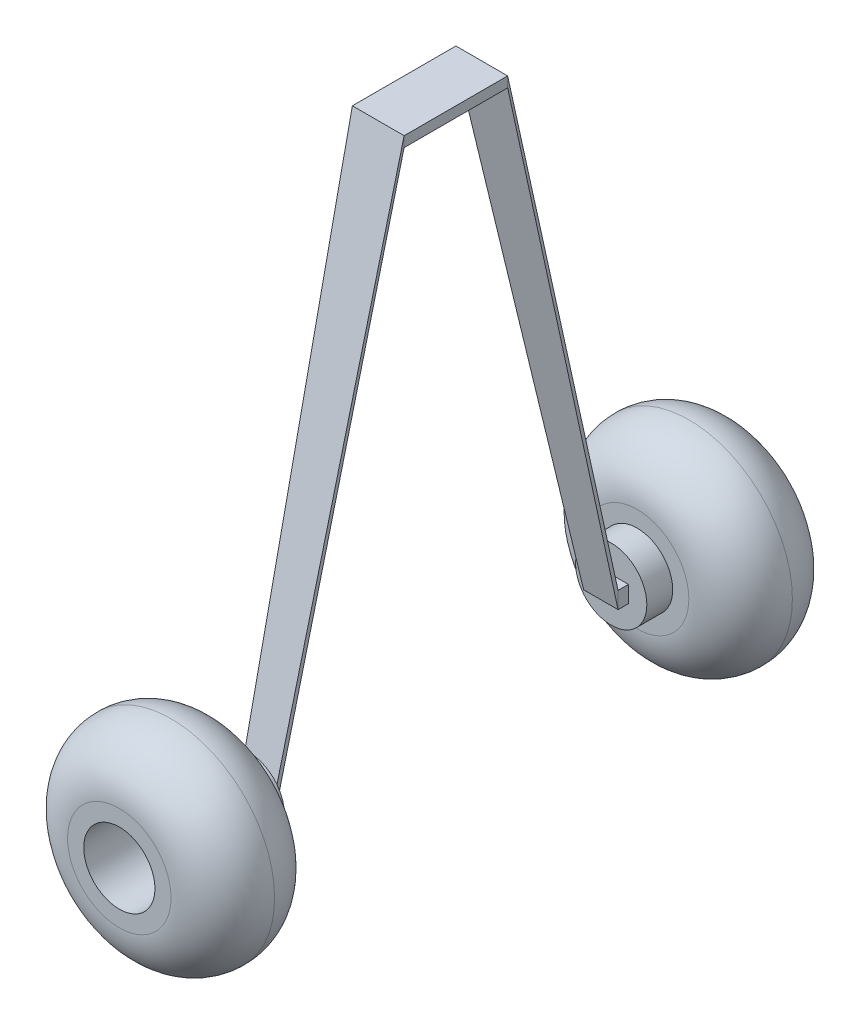
ISO-10303-21;
HEADER;
FILE_DESCRIPTION(('STEP AP214'),'2;1');
FILE_NAME('part.step','',(''),(''),'','','');
FILE_SCHEMA(('AUTOMOTIVE_DESIGN { 1 0 10303 214 1 1 1 1 }'));
ENDSEC;
DATA;
#1=APPLICATION_CONTEXT('core data for automotive mechanical design processes');
#2=APPLICATION_PROTOCOL_DEFINITION('international standard','automotive_design',2000,#1);
#3=PRODUCT_CONTEXT('',#1,'mechanical');
#4=PRODUCT('Part','Part','',(#3));
#5=PRODUCT_RELATED_PRODUCT_CATEGORY('part','',(#4));
#6=PRODUCT_DEFINITION_FORMATION('','',#4);
#7=PRODUCT_DEFINITION_CONTEXT('part definition',#1,'design');
#8=PRODUCT_DEFINITION('design','',#6,#7);
#9=PRODUCT_DEFINITION_SHAPE('','',#8);
#10=(LENGTH_UNIT() NAMED_UNIT(*) SI_UNIT(.MILLI.,.METRE.));
#11=(NAMED_UNIT(*) PLANE_ANGLE_UNIT() SI_UNIT($,.RADIAN.));
#12=(NAMED_UNIT(*) SI_UNIT($,.STERADIAN.) SOLID_ANGLE_UNIT());
#13=UNCERTAINTY_MEASURE_WITH_UNIT(LENGTH_MEASURE(1.E-05),#10,'distance_accuracy_value','');
#14=(GEOMETRIC_REPRESENTATION_CONTEXT(3) GLOBAL_UNCERTAINTY_ASSIGNED_CONTEXT((#13)) GLOBAL_UNIT_ASSIGNED_CONTEXT((#10,
#11,#12)) REPRESENTATION_CONTEXT('',''));
#15=CARTESIAN_POINT('',(0.,0.,0.));
#16=DIRECTION('',(0.,0.,1.));
#17=DIRECTION('',(1.,0.,0.));
#18=AXIS2_PLACEMENT_3D('',#15,#16,#17);
#19=CARTESIAN_POINT('',(0.,0.,-160.));
#20=DIRECTION('',(0.,0.,1.));
#21=DIRECTION('',(1.,0.,0.));
#22=AXIS2_PLACEMENT_3D('',#19,#20,#21);
#23=PLANE('',#22);
#24=CARTESIAN_POINT('',(0.,0.,-160.));
#25=DIRECTION('',(0.,0.,1.));
#26=DIRECTION('',(1.,0.,0.));
#27=AXIS2_PLACEMENT_3D('',#24,#25,#26);
#28=CIRCLE('',#27,19.9762942594619);
#29=CARTESIAN_POINT('',(19.9762942594619,0.,-160.));
#30=VERTEX_POINT('',#29);
#31=EDGE_CURVE('E12',#30,#30,#28,.T.);
#32=ORIENTED_EDGE('',*,*,#31,.T.);
#33=EDGE_LOOP('',(#32));
#34=FACE_BOUND('',#33,.T.);
#35=CARTESIAN_POINT('',(0.,0.,-160.));
#36=DIRECTION('',(0.,0.,1.));
#37=DIRECTION('',(1.,0.,0.));
#38=AXIS2_PLACEMENT_3D('',#35,#36,#37);
#39=CIRCLE('',#38,13.7512739728367);
#40=CARTESIAN_POINT('',(13.7512739728367,0.,-160.));
#41=VERTEX_POINT('',#40);
#42=EDGE_CURVE('E84',#41,#41,#39,.T.);
#43=ORIENTED_EDGE('',*,*,#42,.F.);
#44=EDGE_LOOP('',(#43));
#45=FACE_BOUND('',#44,.T.);
#46=ADVANCED_FACE('F72',(#34,#45),#23,.T.);
#47=CARTESIAN_POINT('',(0.,0.,-200.));
#48=DIRECTION('',(0.,0.,1.));
#49=DIRECTION('',(1.,0.,0.));
#50=AXIS2_PLACEMENT_3D('',#47,#48,#49);
#51=PLANE('',#50);
#52=CARTESIAN_POINT('',(0.,0.,-200.));
#53=DIRECTION('',(0.,0.,1.));
#54=DIRECTION('',(1.,0.,0.));
#55=AXIS2_PLACEMENT_3D('',#52,#53,#54);
#56=CIRCLE('',#55,19.9762942594619);
#57=CARTESIAN_POINT('',(19.9762942594619,0.,-200.));
#58=VERTEX_POINT('',#57);
#59=EDGE_CURVE('E80',#58,#58,#56,.F.);
#60=ORIENTED_EDGE('',*,*,#59,.T.);
#61=EDGE_LOOP('',(#60));
#62=FACE_BOUND('',#61,.T.);
#63=CARTESIAN_POINT('',(0.,0.,-200.));
#64=DIRECTION('',(0.,0.,1.));
#65=DIRECTION('',(1.,0.,0.));
#66=AXIS2_PLACEMENT_3D('',#63,#64,#65);
#67=CIRCLE('',#66,13.7512739728367);
#68=CARTESIAN_POINT('',(13.7512739728367,0.,-200.));
#69=VERTEX_POINT('',#68);
#70=EDGE_CURVE('E87',#69,#69,#67,.T.);
#71=ORIENTED_EDGE('',*,*,#70,.T.);
#72=EDGE_LOOP('',(#71));
#73=FACE_BOUND('',#72,.T.);
#74=ADVANCED_FACE('F97',(#62,#73),#51,.F.);
#75=CARTESIAN_POINT('',(0.,0.,-160.));
#76=DIRECTION('',(0.,0.,-1.));
#77=DIRECTION('',(-1.,0.,0.));
#78=AXIS2_PLACEMENT_3D('',#75,#76,#77);
#79=CYLINDRICAL_SURFACE('',#78,13.7512739728367);
#80=ORIENTED_EDGE('',*,*,#42,.T.);
#81=EDGE_LOOP('',(#80));
#82=FACE_BOUND('',#81,.T.);
#83=ORIENTED_EDGE('',*,*,#70,.F.);
#84=EDGE_LOOP('',(#83));
#85=FACE_BOUND('',#84,.T.);
#86=ADVANCED_FACE('F93',(#82,#85),#79,.F.);
#87=CARTESIAN_POINT('',(0.,0.,-180.));
#88=DIRECTION('',(0.,0.,1.));
#89=DIRECTION('',(1.,0.,0.));
#90=AXIS2_PLACEMENT_3D('',#87,#88,#89);
#91=DEGENERATE_TOROIDAL_SURFACE('',#90,19.9762942594619,20.,.T.);
#92=ORIENTED_EDGE('',*,*,#31,.F.);
#93=EDGE_LOOP('',(#92));
#94=FACE_BOUND('',#93,.T.);
#95=CARTESIAN_POINT('',(0.,0.,-180.));
#96=DIRECTION('',(0.,0.,1.));
#97=DIRECTION('',(1.,0.,0.));
#98=AXIS2_PLACEMENT_3D('',#95,#96,#97);
#99=CIRCLE('',#98,39.9762942594619);
#100=CARTESIAN_POINT('',(39.9762942594619,0.,-180.));
#101=VERTEX_POINT('',#100);
#102=EDGE_CURVE('E76',#101,#101,#99,.F.);
#103=ORIENTED_EDGE('',*,*,#102,.F.);
#104=EDGE_LOOP('',(#103));
#105=FACE_BOUND('',#104,.T.);
#106=ADVANCED_FACE('F74',(#94,#105),#91,.T.);
#107=CARTESIAN_POINT('',(0.,0.,-180.));
#108=DIRECTION('',(0.,0.,1.));
#109=DIRECTION('',(1.,0.,0.));
#110=AXIS2_PLACEMENT_3D('',#107,#108,#109);
#111=DEGENERATE_TOROIDAL_SURFACE('',#110,19.9762942594619,20.,.T.);
#112=ORIENTED_EDGE('',*,*,#59,.F.);
#113=EDGE_LOOP('',(#112));
#114=FACE_BOUND('',#113,.T.);
#115=ORIENTED_EDGE('',*,*,#102,.T.);
#116=EDGE_LOOP('',(#115));
#117=FACE_BOUND('',#116,.T.);
#118=ADVANCED_FACE('F105',(#114,#117),#111,.T.);
#119=CLOSED_SHELL('',(#46,#74,#86,#106,#118));
#120=MANIFOLD_SOLID_BREP('B2',#119);
#121=CARTESIAN_POINT('',(0.,0.,-10.));
#122=DIRECTION('',(0.,0.,-1.));
#123=DIRECTION('',(-1.,0.,0.));
#124=AXIS2_PLACEMENT_3D('',#121,#122,#123);
#125=PLANE('',#124);
#126=CARTESIAN_POINT('',(0.,0.,-10.));
#127=DIRECTION('',(0.,0.,-1.));
#128=DIRECTION('',(-1.,0.,0.));
#129=AXIS2_PLACEMENT_3D('',#126,#127,#128);
#130=CIRCLE('',#129,13.7512739728367);
#131=CARTESIAN_POINT('',(-13.7512739728367,0.,-10.));
#132=VERTEX_POINT('',#131);
#133=EDGE_CURVE('E70',#132,#132,#130,.T.);
#134=ORIENTED_EDGE('',*,*,#133,.T.);
#135=EDGE_LOOP('',(#134));
#136=FACE_BOUND('',#135,.T.);
#137=DIRECTION('',(-1.,0.,0.));
#138=VECTOR('',#137,1.);
#139=CARTESIAN_POINT('',(6.64674504633095,-3.23105661974372,-10.));
#140=LINE('',#139,#138);
#141=CARTESIAN_POINT('',(6.64674504633095,-3.23105661974372,-10.));
#142=VERTEX_POINT('',#141);
#143=CARTESIAN_POINT('',(-6.64674504633095,-3.23105661974372,-10.));
#144=VERTEX_POINT('',#143);
#145=EDGE_CURVE('E237',#142,#144,#140,.T.);
#146=ORIENTED_EDGE('',*,*,#145,.F.);
#147=DIRECTION('',(0.,1.,0.));
#148=VECTOR('',#147,1.);
#149=CARTESIAN_POINT('',(6.64674504633095,-3.23105661974372,-10.));
#150=LINE('',#149,#148);
#151=CARTESIAN_POINT('',(6.64674504633095,3.23105661974372,-10.));
#152=VERTEX_POINT('',#151);
#153=EDGE_CURVE('E186',#142,#152,#150,.T.);
#154=ORIENTED_EDGE('',*,*,#153,.T.);
#155=DIRECTION('',(-1.,0.,0.));
#156=VECTOR('',#155,1.);
#157=CARTESIAN_POINT('',(6.64674504633095,3.23105661974372,-10.));
#158=LINE('',#157,#156);
#159=CARTESIAN_POINT('',(-6.64674504633095,3.23105661974372,-10.));
#160=VERTEX_POINT('',#159);
#161=EDGE_CURVE('E546',#152,#160,#158,.T.);
#162=ORIENTED_EDGE('',*,*,#161,.T.);
#163=DIRECTION('',(0.,1.,0.));
#164=VECTOR('',#163,1.);
#165=CARTESIAN_POINT('',(-6.64674504633095,-3.23105661974372,-10.));
#166=LINE('',#165,#164);
#167=EDGE_CURVE('E549',#144,#160,#166,.T.);
#168=ORIENTED_EDGE('',*,*,#167,.F.);
#169=EDGE_LOOP('',(#146,#154,#162,#168));
#170=FACE_BOUND('',#169,.T.);
#171=ADVANCED_FACE('F166',(#136,#170),#125,.T.);
#172=CARTESIAN_POINT('',(0.,0.,-10.));
#173=DIRECTION('',(0.,0.,1.));
#174=DIRECTION('',(1.,0.,0.));
#175=AXIS2_PLACEMENT_3D('',#172,#173,#174);
#176=CYLINDRICAL_SURFACE('',#175,13.7512739728367);
#177=ORIENTED_EDGE('',*,*,#133,.F.);
#178=EDGE_LOOP('',(#177));
#179=FACE_BOUND('',#178,.T.);
#180=CARTESIAN_POINT('',(0.,0.,0.));
#181=DIRECTION('',(0.,0.,-1.));
#182=DIRECTION('',(-1.,0.,0.));
#183=AXIS2_PLACEMENT_3D('',#180,#181,#182);
#184=CIRCLE('',#183,13.7512739728367);
#185=CARTESIAN_POINT('',(-13.7512739728367,0.,0.));
#186=VERTEX_POINT('',#185);
#187=EDGE_CURVE('E177',#186,#186,#184,.T.);
#188=ORIENTED_EDGE('',*,*,#187,.T.);
#189=EDGE_LOOP('',(#188));
#190=FACE_BOUND('',#189,.T.);
#191=ADVANCED_FACE('F168',(#179,#190),#176,.T.);
#192=CARTESIAN_POINT('',(0.,0.,0.));
#193=DIRECTION('',(0.,0.,-1.));
#194=DIRECTION('',(-1.,0.,0.));
#195=AXIS2_PLACEMENT_3D('',#192,#193,#194);
#196=PLANE('',#195);
#197=ORIENTED_EDGE('',*,*,#187,.F.);
#198=EDGE_LOOP('',(#197));
#199=FACE_BOUND('',#198,.T.);
#200=ADVANCED_FACE('F523',(#199),#196,.F.);
#201=CARTESIAN_POINT('',(6.64674504633095,-3.23105661974372,-14.));
#202=DIRECTION('',(1.,0.,0.));
#203=DIRECTION('',(0.,0.,-1.));
#204=AXIS2_PLACEMENT_3D('',#201,#202,#203);
#205=PLANE('',#204);
#206=ORIENTED_EDGE('',*,*,#153,.F.);
#207=DIRECTION('',(0.,0.,1.));
#208=VECTOR('',#207,1.);
#209=CARTESIAN_POINT('',(6.64674504633095,-3.23105661974372,-14.));
#210=LINE('',#209,#208);
#211=CARTESIAN_POINT('',(6.64674504633095,-3.23105661974372,-14.));
#212=VERTEX_POINT('',#211);
#213=EDGE_CURVE('E240',#212,#142,#210,.T.);
#214=ORIENTED_EDGE('',*,*,#213,.F.);
#215=DIRECTION('',(0.,1.,0.));
#216=VECTOR('',#215,1.);
#217=CARTESIAN_POINT('',(6.64674504633095,-3.23105661974372,-14.));
#218=LINE('',#217,#216);
#219=CARTESIAN_POINT('',(6.64674504633095,3.23105661974372,-14.));
#220=VERTEX_POINT('',#219);
#221=EDGE_CURVE('E248',#212,#220,#218,.T.);
#222=ORIENTED_EDGE('',*,*,#221,.T.);
#223=DIRECTION('',(0.,0.,1.));
#224=VECTOR('',#223,1.);
#225=CARTESIAN_POINT('',(6.64674504633095,3.23105661974372,-14.));
#226=LINE('',#225,#224);
#227=EDGE_CURVE('E217',#220,#152,#226,.T.);
#228=ORIENTED_EDGE('',*,*,#227,.T.);
#229=EDGE_LOOP('',(#206,#214,#222,#228));
#230=FACE_BOUND('',#229,.T.);
#231=ADVANCED_FACE('F526',(#230),#205,.T.);
#232=CARTESIAN_POINT('',(6.64674504633095,-3.23105661974372,-14.));
#233=DIRECTION('',(0.,1.,0.));
#234=DIRECTION('',(0.,0.,1.));
#235=AXIS2_PLACEMENT_3D('',#232,#233,#234);
#236=PLANE('',#235);
#237=ORIENTED_EDGE('',*,*,#145,.T.);
#238=DIRECTION('',(0.,0.,1.));
#239=VECTOR('',#238,1.);
#240=CARTESIAN_POINT('',(-6.64674504633095,-3.23105661974372,-14.));
#241=LINE('',#240,#239);
#242=CARTESIAN_POINT('',(-6.64674504633095,-3.2310566197437,-14.));
#243=VERTEX_POINT('',#242);
#244=EDGE_CURVE('E234',#243,#144,#241,.T.);
#245=ORIENTED_EDGE('',*,*,#244,.F.);
#246=DIRECTION('',(1.,0.,0.));
#247=VECTOR('',#246,1.);
#248=CARTESIAN_POINT('',(0.,-3.23105661974372,-14.));
#249=LINE('',#248,#247);
#250=EDGE_CURVE('E205',#212,#243,#249,.F.);
#251=ORIENTED_EDGE('',*,*,#250,.F.);
#252=ORIENTED_EDGE('',*,*,#213,.T.);
#253=EDGE_LOOP('',(#237,#245,#251,#252));
#254=FACE_BOUND('',#253,.T.);
#255=ADVANCED_FACE('F235',(#254),#236,.F.);
#256=CARTESIAN_POINT('',(-6.64674504633095,-3.23105661974372,-14.));
#257=DIRECTION('',(1.,0.,0.));
#258=DIRECTION('',(0.,0.,-1.));
#259=AXIS2_PLACEMENT_3D('',#256,#257,#258);
#260=PLANE('',#259);
#261=ORIENTED_EDGE('',*,*,#167,.T.);
#262=DIRECTION('',(0.,0.,1.));
#263=VECTOR('',#262,1.);
#264=CARTESIAN_POINT('',(-6.64674504633095,3.23105661974372,-14.));
#265=LINE('',#264,#263);
#266=CARTESIAN_POINT('',(-6.64674504633095,3.23105661974374,-14.));
#267=VERTEX_POINT('',#266);
#268=EDGE_CURVE('E241',#267,#160,#265,.T.);
#269=ORIENTED_EDGE('',*,*,#268,.F.);
#270=DIRECTION('',(0.,1.,0.));
#271=VECTOR('',#270,1.);
#272=CARTESIAN_POINT('',(-6.64674504633095,0.,-14.));
#273=LINE('',#272,#271);
#274=EDGE_CURVE('E218',#243,#267,#273,.T.);
#275=ORIENTED_EDGE('',*,*,#274,.F.);
#276=ORIENTED_EDGE('',*,*,#244,.T.);
#277=EDGE_LOOP('',(#261,#269,#275,#276));
#278=FACE_BOUND('',#277,.T.);
#279=ADVANCED_FACE('F243',(#278),#260,.F.);
#280=CARTESIAN_POINT('',(6.64674504633095,3.23105661974372,-14.));
#281=DIRECTION('',(0.,1.,0.));
#282=DIRECTION('',(0.,0.,1.));
#283=AXIS2_PLACEMENT_3D('',#280,#281,#282);
#284=PLANE('',#283);
#285=ORIENTED_EDGE('',*,*,#161,.F.);
#286=ORIENTED_EDGE('',*,*,#227,.F.);
#287=DIRECTION('',(1.,0.,0.));
#288=VECTOR('',#287,1.);
#289=CARTESIAN_POINT('',(6.64674504633095,3.23105661974372,-14.));
#290=LINE('',#289,#288);
#291=EDGE_CURVE('E246',#220,#267,#290,.F.);
#292=ORIENTED_EDGE('',*,*,#291,.T.);
#293=ORIENTED_EDGE('',*,*,#268,.T.);
#294=EDGE_LOOP('',(#285,#286,#292,#293));
#295=FACE_BOUND('',#294,.T.);
#296=ADVANCED_FACE('F547',(#295),#284,.T.);
#297=CARTESIAN_POINT('',(0.,-3.23235837427785,-13.9996994408925));
#298=DIRECTION('',(0.,-0.224969099182776,-0.974365898629919));
#299=DIRECTION('',(0.,0.97436589862992,-0.224969099182776));
#300=AXIS2_PLACEMENT_3D('',#297,#298,#299);
#301=PLANE('',#300);
#302=DIRECTION('',(-0.0163973331212357,0.97423489970997,-0.22493885314373));
#303=VECTOR('',#302,1.);
#304=CARTESIAN_POINT('',(-6.64674504633095,-3.23105661974372,-14.));
#305=LINE('',#304,#303);
#306=CARTESIAN_POINT('',(-9.99999999999998,196.,-60.));
#307=VERTEX_POINT('',#306);
#308=EDGE_CURVE('E209',#243,#307,#305,.T.);
#309=ORIENTED_EDGE('',*,*,#308,.T.);
#310=DIRECTION('',(1.,0.,0.));
#311=VECTOR('',#310,1.);
#312=CARTESIAN_POINT('',(-9.99999999999998,196.,-60.));
#313=LINE('',#312,#311);
#314=CARTESIAN_POINT('',(10.,196.,-60.));
#315=VERTEX_POINT('',#314);
#316=EDGE_CURVE('E366',#307,#315,#313,.T.);
#317=ORIENTED_EDGE('',*,*,#316,.T.);
#318=DIRECTION('',(0.0163973331212358,0.97423489970997,-0.22493885314373));
#319=VECTOR('',#318,1.);
#320=CARTESIAN_POINT('',(6.64674504633095,-3.23105661974372,-14.));
#321=LINE('',#320,#319);
#322=EDGE_CURVE('E212',#212,#315,#321,.T.);
#323=ORIENTED_EDGE('',*,*,#322,.F.);
#324=ORIENTED_EDGE('',*,*,#250,.T.);
#325=EDGE_LOOP('',(#309,#317,#323,#324));
#326=FACE_BOUND('',#325,.T.);
#327=ADVANCED_FACE('F207',(#326),#301,.T.);
#328=CARTESIAN_POINT('',(5.59644993419326,0.,0.407963553582487));
#329=DIRECTION('',(0.997353567461854,0.,0.0727039302315428));
#330=DIRECTION('',(0.0727039302315428,0.,-0.997353567461854));
#331=AXIS2_PLACEMENT_3D('',#328,#329,#330);
#332=PLANE('',#331);
#333=ORIENTED_EDGE('',*,*,#322,.T.);
#334=DIRECTION('',(0.,1.,0.));
#335=VECTOR('',#334,1.);
#336=CARTESIAN_POINT('',(10.,196.,-60.));
#337=LINE('',#336,#335);
#338=CARTESIAN_POINT('',(10.,200.,-60.));
#339=VERTEX_POINT('',#338);
#340=EDGE_CURVE('E329',#315,#339,#337,.T.);
#341=ORIENTED_EDGE('',*,*,#340,.T.);
#342=DIRECTION('',(0.0165918852304711,0.973611541798827,-0.227607721794779));
#343=VECTOR('',#342,1.);
#344=CARTESIAN_POINT('',(6.64674504633095,3.23105661974372,-14.));
#345=LINE('',#344,#343);
#346=EDGE_CURVE('E310',#220,#339,#345,.T.);
#347=ORIENTED_EDGE('',*,*,#346,.F.);
#348=ORIENTED_EDGE('',*,*,#221,.F.);
#349=EDGE_LOOP('',(#333,#341,#347,#348));
#350=FACE_BOUND('',#349,.T.);
#351=ADVANCED_FACE('F335',(#350),#332,.T.);
#352=CARTESIAN_POINT('',(-5.59644993419327,0.,0.407963553582485));
#353=DIRECTION('',(0.997353567461854,0.,-0.0727039302315423));
#354=DIRECTION('',(-0.0727039302315423,0.,-0.997353567461854));
#355=AXIS2_PLACEMENT_3D('',#352,#353,#354);
#356=PLANE('',#355);
#357=DIRECTION('',(-0.016591885230471,0.973611541798827,-0.227607721794779));
#358=VECTOR('',#357,1.);
#359=CARTESIAN_POINT('',(-6.64674504633095,3.23105661974372,-14.));
#360=LINE('',#359,#358);
#361=CARTESIAN_POINT('',(-9.99999999999998,200.,-60.));
#362=VERTEX_POINT('',#361);
#363=EDGE_CURVE('E314',#267,#362,#360,.T.);
#364=ORIENTED_EDGE('',*,*,#363,.T.);
#365=DIRECTION('',(0.,1.,0.));
#366=VECTOR('',#365,1.);
#367=CARTESIAN_POINT('',(-9.99999999999998,196.,-60.));
#368=LINE('',#367,#366);
#369=EDGE_CURVE('E228',#307,#362,#368,.T.);
#370=ORIENTED_EDGE('',*,*,#369,.F.);
#371=ORIENTED_EDGE('',*,*,#308,.F.);
#372=ORIENTED_EDGE('',*,*,#274,.T.);
#373=EDGE_LOOP('',(#364,#370,#371,#372));
#374=FACE_BOUND('',#373,.T.);
#375=ADVANCED_FACE('F224',(#374),#356,.F.);
#376=CARTESIAN_POINT('',(0.,-2.93584350267639,-12.5583222598135));
#377=DIRECTION('',(0.,-0.227639057404193,-0.97374558255436));
#378=DIRECTION('',(0.,0.97374558255436,-0.227639057404193));
#379=AXIS2_PLACEMENT_3D('',#376,#377,#378);
#380=PLANE('',#379);
#381=ORIENTED_EDGE('',*,*,#346,.T.);
#382=DIRECTION('',(1.,0.,0.));
#383=VECTOR('',#382,1.);
#384=CARTESIAN_POINT('',(-9.99999999999998,200.,-60.));
#385=LINE('',#384,#383);
#386=EDGE_CURVE('E313',#362,#339,#385,.T.);
#387=ORIENTED_EDGE('',*,*,#386,.F.);
#388=ORIENTED_EDGE('',*,*,#363,.F.);
#389=ORIENTED_EDGE('',*,*,#291,.F.);
#390=EDGE_LOOP('',(#381,#387,#388,#389));
#391=FACE_BOUND('',#390,.T.);
#392=ADVANCED_FACE('F349',(#391),#380,.F.);
#393=CARTESIAN_POINT('',(0.,0.,-150.));
#394=DIRECTION('',(0.,0.,1.));
#395=DIRECTION('',(1.,0.,0.));
#396=AXIS2_PLACEMENT_3D('',#393,#394,#395);
#397=PLANE('',#396);
#398=CARTESIAN_POINT('',(0.,0.,-150.));
#399=DIRECTION('',(0.,0.,1.));
#400=DIRECTION('',(1.,0.,0.));
#401=AXIS2_PLACEMENT_3D('',#398,#399,#400);
#402=CIRCLE('',#401,13.7512739728367);
#403=CARTESIAN_POINT('',(13.7512739728367,0.,-150.));
#404=VERTEX_POINT('',#403);
#405=EDGE_CURVE('E230',#404,#404,#402,.T.);
#406=ORIENTED_EDGE('',*,*,#405,.T.);
#407=EDGE_LOOP('',(#406));
#408=FACE_BOUND('',#407,.T.);
#409=DIRECTION('',(1.,0.,0.));
#410=VECTOR('',#409,1.);
#411=CARTESIAN_POINT('',(-6.64674504633095,-3.23105661974372,-150.));
#412=LINE('',#411,#410);
#413=CARTESIAN_POINT('',(-6.64674504633095,-3.23105661974372,-150.));
#414=VERTEX_POINT('',#413);
#415=CARTESIAN_POINT('',(6.64674504633095,-3.23105661974372,-150.));
#416=VERTEX_POINT('',#415);
#417=EDGE_CURVE('E388',#414,#416,#412,.T.);
#418=ORIENTED_EDGE('',*,*,#417,.F.);
#419=DIRECTION('',(0.,1.,0.));
#420=VECTOR('',#419,1.);
#421=CARTESIAN_POINT('',(-6.64674504633095,-3.23105661974372,-150.));
#422=LINE('',#421,#420);
#423=CARTESIAN_POINT('',(-6.64674504633095,3.23105661974372,-150.));
#424=VERTEX_POINT('',#423);
#425=EDGE_CURVE('E371',#414,#424,#422,.T.);
#426=ORIENTED_EDGE('',*,*,#425,.T.);
#427=DIRECTION('',(1.,0.,0.));
#428=VECTOR('',#427,1.);
#429=CARTESIAN_POINT('',(-6.64674504633095,3.23105661974372,-150.));
#430=LINE('',#429,#428);
#431=CARTESIAN_POINT('',(6.64674504633095,3.23105661974372,-150.));
#432=VERTEX_POINT('',#431);
#433=EDGE_CURVE('E382',#424,#432,#430,.T.);
#434=ORIENTED_EDGE('',*,*,#433,.T.);
#435=DIRECTION('',(0.,1.,0.));
#436=VECTOR('',#435,1.);
#437=CARTESIAN_POINT('',(6.64674504633095,-3.23105661974372,-150.));
#438=LINE('',#437,#436);
#439=EDGE_CURVE('E385',#416,#432,#438,.T.);
#440=ORIENTED_EDGE('',*,*,#439,.F.);
#441=EDGE_LOOP('',(#418,#426,#434,#440));
#442=FACE_BOUND('',#441,.T.);
#443=ADVANCED_FACE('F504',(#408,#442),#397,.T.);
#444=CARTESIAN_POINT('',(0.,0.,-150.));
#445=DIRECTION('',(0.,0.,-1.));
#446=DIRECTION('',(-1.,0.,0.));
#447=AXIS2_PLACEMENT_3D('',#444,#445,#446);
#448=CYLINDRICAL_SURFACE('',#447,13.7512739728367);
#449=ORIENTED_EDGE('',*,*,#405,.F.);
#450=EDGE_LOOP('',(#449));
#451=FACE_BOUND('',#450,.T.);
#452=CARTESIAN_POINT('',(0.,0.,-160.));
#453=DIRECTION('',(0.,0.,1.));
#454=DIRECTION('',(1.,0.,0.));
#455=AXIS2_PLACEMENT_3D('',#452,#453,#454);
#456=CIRCLE('',#455,13.7512739728367);
#457=CARTESIAN_POINT('',(13.7512739728367,0.,-160.));
#458=VERTEX_POINT('',#457);
#459=EDGE_CURVE('E394',#458,#458,#456,.T.);
#460=ORIENTED_EDGE('',*,*,#459,.T.);
#461=EDGE_LOOP('',(#460));
#462=FACE_BOUND('',#461,.T.);
#463=ADVANCED_FACE('F507',(#451,#462),#448,.T.);
#464=CARTESIAN_POINT('',(0.,0.,-160.));
#465=DIRECTION('',(0.,0.,1.));
#466=DIRECTION('',(1.,0.,0.));
#467=AXIS2_PLACEMENT_3D('',#464,#465,#466);
#468=PLANE('',#467);
#469=ORIENTED_EDGE('',*,*,#459,.F.);
#470=EDGE_LOOP('',(#469));
#471=FACE_BOUND('',#470,.T.);
#472=ADVANCED_FACE('F502',(#471),#468,.F.);
#473=CARTESIAN_POINT('',(-6.64674504633095,-3.23105661974372,-146.));
#474=DIRECTION('',(-1.,0.,0.));
#475=DIRECTION('',(0.,0.,1.));
#476=AXIS2_PLACEMENT_3D('',#473,#474,#475);
#477=PLANE('',#476);
#478=ORIENTED_EDGE('',*,*,#425,.F.);
#479=DIRECTION('',(0.,0.,-1.));
#480=VECTOR('',#479,1.);
#481=CARTESIAN_POINT('',(-6.64674504633095,-3.23105661974372,-146.));
#482=LINE('',#481,#480);
#483=CARTESIAN_POINT('',(-6.64674504633095,-3.23105661974373,-146.));
#484=VERTEX_POINT('',#483);
#485=EDGE_CURVE('E397',#484,#414,#482,.T.);
#486=ORIENTED_EDGE('',*,*,#485,.F.);
#487=DIRECTION('',(0.,1.,0.));
#488=VECTOR('',#487,1.);
#489=CARTESIAN_POINT('',(-6.64674504633095,-3.23105661974372,-146.));
#490=LINE('',#489,#488);
#491=CARTESIAN_POINT('',(-6.64674504633095,3.23105661974372,-146.));
#492=VERTEX_POINT('',#491);
#493=EDGE_CURVE('E391',#484,#492,#490,.T.);
#494=ORIENTED_EDGE('',*,*,#493,.T.);
#495=DIRECTION('',(0.,0.,-1.));
#496=VECTOR('',#495,1.);
#497=CARTESIAN_POINT('',(-6.64674504633095,3.23105661974372,-146.));
#498=LINE('',#497,#496);
#499=EDGE_CURVE('E402',#492,#424,#498,.T.);
#500=ORIENTED_EDGE('',*,*,#499,.T.);
#501=EDGE_LOOP('',(#478,#486,#494,#500));
#502=FACE_BOUND('',#501,.T.);
#503=ADVANCED_FACE('F491',(#502),#477,.T.);
#504=CARTESIAN_POINT('',(-6.64674504633095,-3.23105661974372,-146.));
#505=DIRECTION('',(0.,1.,0.));
#506=DIRECTION('',(0.,0.,1.));
#507=AXIS2_PLACEMENT_3D('',#504,#505,#506);
#508=PLANE('',#507);
#509=ORIENTED_EDGE('',*,*,#417,.T.);
#510=DIRECTION('',(0.,0.,-1.));
#511=VECTOR('',#510,1.);
#512=CARTESIAN_POINT('',(6.64674504633095,-3.23105661974372,-146.));
#513=LINE('',#512,#511);
#514=CARTESIAN_POINT('',(6.64674504633095,-3.23105661974373,-146.));
#515=VERTEX_POINT('',#514);
#516=EDGE_CURVE('E401',#515,#416,#513,.T.);
#517=ORIENTED_EDGE('',*,*,#516,.F.);
#518=DIRECTION('',(1.,0.,0.));
#519=VECTOR('',#518,1.);
#520=CARTESIAN_POINT('',(0.,-3.23105661974374,-146.));
#521=LINE('',#520,#519);
#522=EDGE_CURVE('E405',#484,#515,#521,.T.);
#523=ORIENTED_EDGE('',*,*,#522,.F.);
#524=ORIENTED_EDGE('',*,*,#485,.T.);
#525=EDGE_LOOP('',(#509,#517,#523,#524));
#526=FACE_BOUND('',#525,.T.);
#527=ADVANCED_FACE('F487',(#526),#508,.F.);
#528=CARTESIAN_POINT('',(6.64674504633095,-3.23105661974372,-146.));
#529=DIRECTION('',(-1.,0.,0.));
#530=DIRECTION('',(0.,0.,1.));
#531=AXIS2_PLACEMENT_3D('',#528,#529,#530);
#532=PLANE('',#531);
#533=ORIENTED_EDGE('',*,*,#439,.T.);
#534=DIRECTION('',(0.,0.,-1.));
#535=VECTOR('',#534,1.);
#536=CARTESIAN_POINT('',(6.64674504633095,3.23105661974372,-146.));
#537=LINE('',#536,#535);
#538=CARTESIAN_POINT('',(6.64674504633095,3.23105661974372,-146.));
#539=VERTEX_POINT('',#538);
#540=EDGE_CURVE('E398',#539,#432,#537,.T.);
#541=ORIENTED_EDGE('',*,*,#540,.F.);
#542=DIRECTION('',(0.,1.,0.));
#543=VECTOR('',#542,1.);
#544=CARTESIAN_POINT('',(6.64674504633095,0.,-146.));
#545=LINE('',#544,#543);
#546=EDGE_CURVE('E413',#515,#539,#545,.T.);
#547=ORIENTED_EDGE('',*,*,#546,.F.);
#548=ORIENTED_EDGE('',*,*,#516,.T.);
#549=EDGE_LOOP('',(#533,#541,#547,#548));
#550=FACE_BOUND('',#549,.T.);
#551=ADVANCED_FACE('F490',(#550),#532,.F.);
#552=CARTESIAN_POINT('',(-6.64674504633095,3.23105661974372,-146.));
#553=DIRECTION('',(0.,1.,0.));
#554=DIRECTION('',(0.,0.,1.));
#555=AXIS2_PLACEMENT_3D('',#552,#553,#554);
#556=PLANE('',#555);
#557=ORIENTED_EDGE('',*,*,#433,.F.);
#558=ORIENTED_EDGE('',*,*,#499,.F.);
#559=DIRECTION('',(1.,0.,0.));
#560=VECTOR('',#559,1.);
#561=CARTESIAN_POINT('',(-6.64674504633095,3.23105661974372,-146.));
#562=LINE('',#561,#560);
#563=EDGE_CURVE('E410',#492,#539,#562,.T.);
#564=ORIENTED_EDGE('',*,*,#563,.T.);
#565=ORIENTED_EDGE('',*,*,#540,.T.);
#566=EDGE_LOOP('',(#557,#558,#564,#565));
#567=FACE_BOUND('',#566,.T.);
#568=ADVANCED_FACE('F495',(#567),#556,.T.);
#569=CARTESIAN_POINT('',(0.,31.8399965839923,-137.90252526517));
#570=DIRECTION('',(0.,0.224969099182775,-0.974365898629919));
#571=DIRECTION('',(0.,0.97436589862992,0.224969099182776));
#572=AXIS2_PLACEMENT_3D('',#569,#570,#571);
#573=PLANE('',#572);
#574=DIRECTION('',(0.0163973331212358,0.97423489970997,0.22493885314373));
#575=VECTOR('',#574,1.);
#576=CARTESIAN_POINT('',(6.64674504633095,-3.23105661974372,-146.));
#577=LINE('',#576,#575);
#578=CARTESIAN_POINT('',(10.,196.,-100.));
#579=VERTEX_POINT('',#578);
#580=EDGE_CURVE('E443',#515,#579,#577,.T.);
#581=ORIENTED_EDGE('',*,*,#580,.T.);
#582=DIRECTION('',(1.,0.,0.));
#583=VECTOR('',#582,1.);
#584=CARTESIAN_POINT('',(-9.99999999999999,196.,-100.));
#585=LINE('',#584,#583);
#586=CARTESIAN_POINT('',(-9.99999999999999,196.,-100.));
#587=VERTEX_POINT('',#586);
#588=EDGE_CURVE('E298',#587,#579,#585,.T.);
#589=ORIENTED_EDGE('',*,*,#588,.F.);
#590=DIRECTION('',(-0.0163973331212358,0.97423489970997,0.22493885314373));
#591=VECTOR('',#590,1.);
#592=CARTESIAN_POINT('',(-6.64674504633095,-3.23105661974372,-146.));
#593=LINE('',#592,#591);
#594=EDGE_CURVE('E449',#484,#587,#593,.T.);
#595=ORIENTED_EDGE('',*,*,#594,.F.);
#596=ORIENTED_EDGE('',*,*,#522,.T.);
#597=EDGE_LOOP('',(#581,#589,#595,#596));
#598=FACE_BOUND('',#597,.T.);
#599=ADVANCED_FACE('F479',(#598),#573,.F.);
#600=CARTESIAN_POINT('',(-17.1982938037815,0.,-1.25370138896057));
#601=DIRECTION('',(-0.997353567461854,0.,-0.0727039302315426));
#602=DIRECTION('',(-0.0727039302315426,0.,0.997353567461854));
#603=AXIS2_PLACEMENT_3D('',#600,#601,#602);
#604=PLANE('',#603);
#605=ORIENTED_EDGE('',*,*,#594,.T.);
#606=DIRECTION('',(0.,1.,0.));
#607=VECTOR('',#606,1.);
#608=CARTESIAN_POINT('',(-9.99999999999999,196.,-100.));
#609=LINE('',#608,#607);
#610=CARTESIAN_POINT('',(-9.99999999999999,200.,-100.));
#611=VERTEX_POINT('',#610);
#612=EDGE_CURVE('E301',#587,#611,#609,.T.);
#613=ORIENTED_EDGE('',*,*,#612,.T.);
#614=DIRECTION('',(-0.0165918852304711,0.973611541798827,0.227607721794779));
#615=VECTOR('',#614,1.);
#616=CARTESIAN_POINT('',(-6.64674504633095,3.23105661974372,-146.));
#617=LINE('',#616,#615);
#618=EDGE_CURVE('E307',#492,#611,#617,.T.);
#619=ORIENTED_EDGE('',*,*,#618,.F.);
#620=ORIENTED_EDGE('',*,*,#493,.F.);
#621=EDGE_LOOP('',(#605,#613,#619,#620));
#622=FACE_BOUND('',#621,.T.);
#623=ADVANCED_FACE('F470',(#622),#604,.T.);
#624=CARTESIAN_POINT('',(17.1982938037816,0.,-1.25370138896057));
#625=DIRECTION('',(-0.997353567461854,0.,0.0727039302315428));
#626=DIRECTION('',(0.0727039302315428,0.,0.997353567461854));
#627=AXIS2_PLACEMENT_3D('',#624,#625,#626);
#628=PLANE('',#627);
#629=DIRECTION('',(0.0165918852304711,0.973611541798827,0.227607721794779));
#630=VECTOR('',#629,1.);
#631=CARTESIAN_POINT('',(6.64674504633095,3.23105661974372,-146.));
#632=LINE('',#631,#630);
#633=CARTESIAN_POINT('',(10.,200.,-100.));
#634=VERTEX_POINT('',#633);
#635=EDGE_CURVE('E456',#539,#634,#632,.T.);
#636=ORIENTED_EDGE('',*,*,#635,.T.);
#637=DIRECTION('',(0.,1.,0.));
#638=VECTOR('',#637,1.);
#639=CARTESIAN_POINT('',(10.,196.,-100.));
#640=LINE('',#639,#638);
#641=EDGE_CURVE('E170',#579,#634,#640,.T.);
#642=ORIENTED_EDGE('',*,*,#641,.F.);
#643=ORIENTED_EDGE('',*,*,#580,.F.);
#644=ORIENTED_EDGE('',*,*,#546,.T.);
#645=EDGE_LOOP('',(#636,#642,#643,#644));
#646=FACE_BOUND('',#645,.T.);
#647=ADVANCED_FACE('F478',(#646),#628,.F.);
#648=CARTESIAN_POINT('',(0.,32.530160747591,-139.150551267247));
#649=DIRECTION('',(0.,0.227639057404193,-0.97374558255436));
#650=DIRECTION('',(0.,0.97374558255436,0.227639057404193));
#651=AXIS2_PLACEMENT_3D('',#648,#649,#650);
#652=PLANE('',#651);
#653=ORIENTED_EDGE('',*,*,#618,.T.);
#654=DIRECTION('',(1.,0.,0.));
#655=VECTOR('',#654,1.);
#656=CARTESIAN_POINT('',(-9.99999999999999,200.,-100.));
#657=LINE('',#656,#655);
#658=EDGE_CURVE('E304',#611,#634,#657,.T.);
#659=ORIENTED_EDGE('',*,*,#658,.T.);
#660=ORIENTED_EDGE('',*,*,#635,.F.);
#661=ORIENTED_EDGE('',*,*,#563,.F.);
#662=EDGE_LOOP('',(#653,#659,#660,#661));
#663=FACE_BOUND('',#662,.T.);
#664=ADVANCED_FACE('F274',(#663),#652,.T.);
#665=CARTESIAN_POINT('',(-9.99999999999998,196.,-60.));
#666=DIRECTION('',(1.,0.,0.));
#667=DIRECTION('',(0.,0.,-1.));
#668=AXIS2_PLACEMENT_3D('',#665,#666,#667);
#669=PLANE('',#668);
#670=DIRECTION('',(0.,0.,-1.));
#671=VECTOR('',#670,1.);
#672=CARTESIAN_POINT('',(-9.99999999999998,200.,-60.));
#673=LINE('',#672,#671);
#674=EDGE_CURVE('E287',#362,#611,#673,.T.);
#675=ORIENTED_EDGE('',*,*,#674,.T.);
#676=ORIENTED_EDGE('',*,*,#612,.F.);
#677=DIRECTION('',(0.,0.,-1.));
#678=VECTOR('',#677,1.);
#679=CARTESIAN_POINT('',(-9.99999999999998,196.,-60.));
#680=LINE('',#679,#678);
#681=EDGE_CURVE('E439',#307,#587,#680,.T.);
#682=ORIENTED_EDGE('',*,*,#681,.F.);
#683=ORIENTED_EDGE('',*,*,#369,.T.);
#684=EDGE_LOOP('',(#675,#676,#682,#683));
#685=FACE_BOUND('',#684,.T.);
#686=ADVANCED_FACE('F263',(#685),#669,.F.);
#687=CARTESIAN_POINT('',(10.,196.,-60.));
#688=DIRECTION('',(1.,0.,0.));
#689=DIRECTION('',(0.,0.,-1.));
#690=AXIS2_PLACEMENT_3D('',#687,#688,#689);
#691=PLANE('',#690);
#692=DIRECTION('',(0.,0.,-1.));
#693=VECTOR('',#692,1.);
#694=CARTESIAN_POINT('',(10.,200.,-60.));
#695=LINE('',#694,#693);
#696=EDGE_CURVE('E295',#339,#634,#695,.T.);
#697=ORIENTED_EDGE('',*,*,#696,.F.);
#698=ORIENTED_EDGE('',*,*,#340,.F.);
#699=DIRECTION('',(0.,0.,-1.));
#700=VECTOR('',#699,1.);
#701=CARTESIAN_POINT('',(10.,196.,-60.));
#702=LINE('',#701,#700);
#703=EDGE_CURVE('E294',#315,#579,#702,.T.);
#704=ORIENTED_EDGE('',*,*,#703,.T.);
#705=ORIENTED_EDGE('',*,*,#641,.T.);
#706=EDGE_LOOP('',(#697,#698,#704,#705));
#707=FACE_BOUND('',#706,.T.);
#708=ADVANCED_FACE('F273',(#707),#691,.T.);
#709=CARTESIAN_POINT('',(0.,196.,0.));
#710=DIRECTION('',(0.,1.,0.));
#711=DIRECTION('',(0.,0.,1.));
#712=AXIS2_PLACEMENT_3D('',#709,#710,#711);
#713=PLANE('',#712);
#714=ORIENTED_EDGE('',*,*,#316,.F.);
#715=ORIENTED_EDGE('',*,*,#681,.T.);
#716=ORIENTED_EDGE('',*,*,#588,.T.);
#717=ORIENTED_EDGE('',*,*,#703,.F.);
#718=EDGE_LOOP('',(#714,#715,#716,#717));
#719=FACE_BOUND('',#718,.T.);
#720=ADVANCED_FACE('F593',(#719),#713,.F.);
#721=CARTESIAN_POINT('',(0.,200.,0.));
#722=DIRECTION('',(0.,1.,0.));
#723=DIRECTION('',(0.,0.,1.));
#724=AXIS2_PLACEMENT_3D('',#721,#722,#723);
#725=PLANE('',#724);
#726=ORIENTED_EDGE('',*,*,#386,.T.);
#727=ORIENTED_EDGE('',*,*,#696,.T.);
#728=ORIENTED_EDGE('',*,*,#658,.F.);
#729=ORIENTED_EDGE('',*,*,#674,.F.);
#730=EDGE_LOOP('',(#726,#727,#728,#729));
#731=FACE_BOUND('',#730,.T.);
#732=ADVANCED_FACE('F275',(#731),#725,.T.);
#733=CLOSED_SHELL('',(#171,#191,#200,#231,#255,#279,#296,#327,#351,#375,#392,#443,#463,#472,
#503,#527,#551,#568,#599,#623,#647,#664,#686,#708,#720,#732));
#734=MANIFOLD_SOLID_BREP('B7',#733);
#735=CARTESIAN_POINT('',(0.,0.,40.));
#736=DIRECTION('',(0.,0.,1.));
#737=DIRECTION('',(1.,0.,0.));
#738=AXIS2_PLACEMENT_3D('',#735,#736,#737);
#739=PLANE('',#738);
#740=CARTESIAN_POINT('',(0.,0.,40.));
#741=DIRECTION('',(0.,0.,1.));
#742=DIRECTION('',(1.,0.,0.));
#743=AXIS2_PLACEMENT_3D('',#740,#741,#742);
#744=CIRCLE('',#743,19.9762942594619);
#745=CARTESIAN_POINT('',(19.9762942594619,0.,40.));
#746=VERTEX_POINT('',#745);
#747=EDGE_CURVE('E165',#746,#746,#744,.T.);
#748=ORIENTED_EDGE('',*,*,#747,.T.);
#749=EDGE_LOOP('',(#748));
#750=FACE_BOUND('',#749,.T.);
#751=CARTESIAN_POINT('',(0.,0.,40.));
#752=DIRECTION('',(0.,0.,1.));
#753=DIRECTION('',(1.,0.,0.));
#754=AXIS2_PLACEMENT_3D('',#751,#752,#753);
#755=CIRCLE('',#754,13.7512739728367);
#756=CARTESIAN_POINT('',(13.7512739728367,0.,40.));
#757=VERTEX_POINT('',#756);
#758=EDGE_CURVE('E854',#757,#757,#755,.T.);
#759=ORIENTED_EDGE('',*,*,#758,.F.);
#760=EDGE_LOOP('',(#759));
#761=FACE_BOUND('',#760,.T.);
#762=ADVANCED_FACE('F842',(#750,#761),#739,.T.);
#763=CARTESIAN_POINT('',(0.,0.,0.));
#764=DIRECTION('',(0.,0.,1.));
#765=DIRECTION('',(1.,0.,0.));
#766=AXIS2_PLACEMENT_3D('',#763,#764,#765);
#767=PLANE('',#766);
#768=CARTESIAN_POINT('',(0.,0.,0.));
#769=DIRECTION('',(0.,0.,1.));
#770=DIRECTION('',(1.,0.,0.));
#771=AXIS2_PLACEMENT_3D('',#768,#769,#770);
#772=CIRCLE('',#771,19.9762942594619);
#773=CARTESIAN_POINT('',(19.9762942594619,0.,0.));
#774=VERTEX_POINT('',#773);
#775=EDGE_CURVE('E850',#774,#774,#772,.F.);
#776=ORIENTED_EDGE('',*,*,#775,.T.);
#777=EDGE_LOOP('',(#776));
#778=FACE_BOUND('',#777,.T.);
#779=CARTESIAN_POINT('',(0.,0.,0.));
#780=DIRECTION('',(0.,0.,1.));
#781=DIRECTION('',(1.,0.,0.));
#782=AXIS2_PLACEMENT_3D('',#779,#780,#781);
#783=CIRCLE('',#782,13.7512739728367);
#784=CARTESIAN_POINT('',(13.7512739728367,0.,0.));
#785=VERTEX_POINT('',#784);
#786=EDGE_CURVE('E857',#785,#785,#783,.T.);
#787=ORIENTED_EDGE('',*,*,#786,.T.);
#788=EDGE_LOOP('',(#787));
#789=FACE_BOUND('',#788,.T.);
#790=ADVANCED_FACE('F867',(#778,#789),#767,.F.);
#791=CARTESIAN_POINT('',(0.,0.,40.));
#792=DIRECTION('',(0.,0.,-1.));
#793=DIRECTION('',(-1.,0.,0.));
#794=AXIS2_PLACEMENT_3D('',#791,#792,#793);
#795=CYLINDRICAL_SURFACE('',#794,13.7512739728367);
#796=ORIENTED_EDGE('',*,*,#758,.T.);
#797=EDGE_LOOP('',(#796));
#798=FACE_BOUND('',#797,.T.);
#799=ORIENTED_EDGE('',*,*,#786,.F.);
#800=EDGE_LOOP('',(#799));
#801=FACE_BOUND('',#800,.T.);
#802=ADVANCED_FACE('F863',(#798,#801),#795,.F.);
#803=CARTESIAN_POINT('',(0.,0.,20.));
#804=DIRECTION('',(0.,0.,1.));
#805=DIRECTION('',(1.,0.,0.));
#806=AXIS2_PLACEMENT_3D('',#803,#804,#805);
#807=DEGENERATE_TOROIDAL_SURFACE('',#806,19.9762942594619,20.,.T.);
#808=ORIENTED_EDGE('',*,*,#747,.F.);
#809=EDGE_LOOP('',(#808));
#810=FACE_BOUND('',#809,.T.);
#811=CARTESIAN_POINT('',(0.,0.,20.));
#812=DIRECTION('',(0.,0.,1.));
#813=DIRECTION('',(1.,0.,0.));
#814=AXIS2_PLACEMENT_3D('',#811,#812,#813);
#815=CIRCLE('',#814,39.9762942594619);
#816=CARTESIAN_POINT('',(39.9762942594619,0.,20.));
#817=VERTEX_POINT('',#816);
#818=EDGE_CURVE('E846',#817,#817,#815,.F.);
#819=ORIENTED_EDGE('',*,*,#818,.F.);
#820=EDGE_LOOP('',(#819));
#821=FACE_BOUND('',#820,.T.);
#822=ADVANCED_FACE('F844',(#810,#821),#807,.T.);
#823=CARTESIAN_POINT('',(0.,0.,20.));
#824=DIRECTION('',(0.,0.,1.));
#825=DIRECTION('',(1.,0.,0.));
#826=AXIS2_PLACEMENT_3D('',#823,#824,#825);
#827=DEGENERATE_TOROIDAL_SURFACE('',#826,19.9762942594619,20.,.T.);
#828=ORIENTED_EDGE('',*,*,#775,.F.);
#829=EDGE_LOOP('',(#828));
#830=FACE_BOUND('',#829,.T.);
#831=ORIENTED_EDGE('',*,*,#818,.T.);
#832=EDGE_LOOP('',(#831));
#833=FACE_BOUND('',#832,.T.);
#834=ADVANCED_FACE('F875',(#830,#833),#827,.T.);
#835=CLOSED_SHELL('',(#762,#790,#802,#822,#834));
#836=MANIFOLD_SOLID_BREP('B64',#835);
#837=ADVANCED_BREP_SHAPE_REPRESENTATION('',(#18,#120,#734,#836),#14);
#838=SHAPE_DEFINITION_REPRESENTATION(#9,#837);
ENDSEC;
END-ISO-10303-21;
